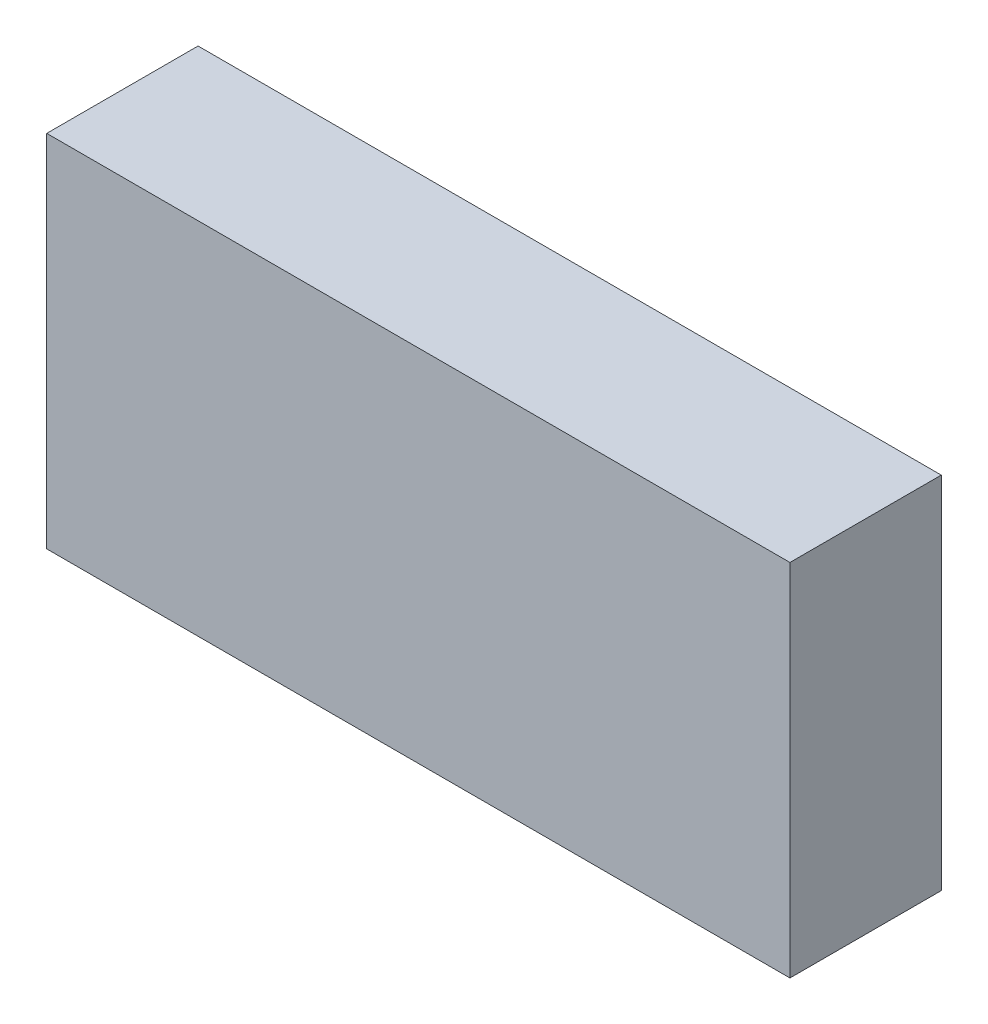
ISO-10303-21;
HEADER;
FILE_DESCRIPTION(('STEP AP214'),'2;1');
FILE_NAME('part.step','',(''),(''),'','','');
FILE_SCHEMA(('AUTOMOTIVE_DESIGN { 1 0 10303 214 1 1 1 1 }'));
ENDSEC;
DATA;
#1=APPLICATION_CONTEXT('core data for automotive mechanical design processes');
#2=APPLICATION_PROTOCOL_DEFINITION('international standard','automotive_design',2000,#1);
#3=PRODUCT_CONTEXT('',#1,'mechanical');
#4=PRODUCT('Part','Part','',(#3));
#5=PRODUCT_RELATED_PRODUCT_CATEGORY('part','',(#4));
#6=PRODUCT_DEFINITION_FORMATION('','',#4);
#7=PRODUCT_DEFINITION_CONTEXT('part definition',#1,'design');
#8=PRODUCT_DEFINITION('design','',#6,#7);
#9=PRODUCT_DEFINITION_SHAPE('','',#8);
#10=(LENGTH_UNIT() NAMED_UNIT(*) SI_UNIT(.MILLI.,.METRE.));
#11=(NAMED_UNIT(*) PLANE_ANGLE_UNIT() SI_UNIT($,.RADIAN.));
#12=(NAMED_UNIT(*) SI_UNIT($,.STERADIAN.) SOLID_ANGLE_UNIT());
#13=UNCERTAINTY_MEASURE_WITH_UNIT(LENGTH_MEASURE(1.E-05),#10,'distance_accuracy_value','');
#14=(GEOMETRIC_REPRESENTATION_CONTEXT(3) GLOBAL_UNCERTAINTY_ASSIGNED_CONTEXT((#13)) GLOBAL_UNIT_ASSIGNED_CONTEXT((#10,
#11,#12)) REPRESENTATION_CONTEXT('',''));
#15=CARTESIAN_POINT('',(0.,0.,0.));
#16=DIRECTION('',(0.,0.,1.));
#17=DIRECTION('',(1.,0.,0.));
#18=AXIS2_PLACEMENT_3D('',#15,#16,#17);
#19=CARTESIAN_POINT('',(-0.0001249999999999,-0.000125,0.6));
#20=DIRECTION('',(0.,0.,1.));
#21=DIRECTION('',(1.,0.,0.));
#22=AXIS2_PLACEMENT_3D('',#19,#20,#21);
#23=PLANE('',#22);
#24=DIRECTION('',(1.,0.,0.));
#25=VECTOR('',#24,1.);
#26=CARTESIAN_POINT('',(-1.47358,-0.71361,0.6));
#27=LINE('',#26,#25);
#28=CARTESIAN_POINT('',(-1.47358,-0.71361,0.6));
#29=VERTEX_POINT('',#28);
#30=CARTESIAN_POINT('',(1.47333,-0.71361,0.6));
#31=VERTEX_POINT('',#30);
#32=EDGE_CURVE('E81',#29,#31,#27,.T.);
#33=ORIENTED_EDGE('',*,*,#32,.T.);
#34=DIRECTION('',(0.,1.,0.));
#35=VECTOR('',#34,1.);
#36=CARTESIAN_POINT('',(1.47333,-0.71361,0.6));
#37=LINE('',#36,#35);
#38=CARTESIAN_POINT('',(1.47333,0.71336,0.6));
#39=VERTEX_POINT('',#38);
#40=EDGE_CURVE('E93',#31,#39,#37,.T.);
#41=ORIENTED_EDGE('',*,*,#40,.T.);
#42=DIRECTION('',(-1.,0.,0.));
#43=VECTOR('',#42,1.);
#44=CARTESIAN_POINT('',(1.47333,0.71336,0.6));
#45=LINE('',#44,#43);
#46=CARTESIAN_POINT('',(-1.47358,0.71336,0.6));
#47=VERTEX_POINT('',#46);
#48=EDGE_CURVE('E66',#39,#47,#45,.T.);
#49=ORIENTED_EDGE('',*,*,#48,.T.);
#50=DIRECTION('',(0.,-1.,0.));
#51=VECTOR('',#50,1.);
#52=CARTESIAN_POINT('',(-1.47358,0.71336,0.6));
#53=LINE('',#52,#51);
#54=EDGE_CURVE('E11',#47,#29,#53,.T.);
#55=ORIENTED_EDGE('',*,*,#54,.T.);
#56=EDGE_LOOP('',(#33,#41,#49,#55));
#57=FACE_BOUND('',#56,.T.);
#58=ADVANCED_FACE('F16',(#57),#23,.T.);
#59=CARTESIAN_POINT('',(-0.0001249999999999,-0.000125,0.));
#60=DIRECTION('',(0.,0.,1.));
#61=DIRECTION('',(1.,0.,0.));
#62=AXIS2_PLACEMENT_3D('',#59,#60,#61);
#63=PLANE('',#62);
#64=DIRECTION('',(1.,0.,0.));
#65=VECTOR('',#64,1.);
#66=CARTESIAN_POINT('',(-1.47358,-0.71361,0.));
#67=LINE('',#66,#65);
#68=CARTESIAN_POINT('',(-1.47358,-0.71361,0.));
#69=VERTEX_POINT('',#68);
#70=CARTESIAN_POINT('',(1.47333,-0.71361,0.));
#71=VERTEX_POINT('',#70);
#72=EDGE_CURVE('E70',#69,#71,#67,.T.);
#73=ORIENTED_EDGE('',*,*,#72,.F.);
#74=DIRECTION('',(0.,-1.,0.));
#75=VECTOR('',#74,1.);
#76=CARTESIAN_POINT('',(-1.47358,0.71336,0.));
#77=LINE('',#76,#75);
#78=CARTESIAN_POINT('',(-1.47358,0.71336,0.));
#79=VERTEX_POINT('',#78);
#80=EDGE_CURVE('E27',#79,#69,#77,.T.);
#81=ORIENTED_EDGE('',*,*,#80,.F.);
#82=DIRECTION('',(-1.,0.,0.));
#83=VECTOR('',#82,1.);
#84=CARTESIAN_POINT('',(1.47333,0.71336,0.));
#85=LINE('',#84,#83);
#86=CARTESIAN_POINT('',(1.47333,0.71336,0.));
#87=VERTEX_POINT('',#86);
#88=EDGE_CURVE('E90',#87,#79,#85,.T.);
#89=ORIENTED_EDGE('',*,*,#88,.F.);
#90=DIRECTION('',(0.,1.,0.));
#91=VECTOR('',#90,1.);
#92=CARTESIAN_POINT('',(1.47333,-0.71361,0.));
#93=LINE('',#92,#91);
#94=EDGE_CURVE('E73',#71,#87,#93,.T.);
#95=ORIENTED_EDGE('',*,*,#94,.F.);
#96=EDGE_LOOP('',(#73,#81,#89,#95));
#97=FACE_BOUND('',#96,.T.);
#98=ADVANCED_FACE('F71',(#97),#63,.F.);
#99=CARTESIAN_POINT('',(-1.47358,0.71336,0.));
#100=DIRECTION('',(1.,0.,0.));
#101=DIRECTION('',(0.,1.,0.));
#102=AXIS2_PLACEMENT_3D('',#99,#100,#101);
#103=PLANE('',#102);
#104=DIRECTION('',(0.,0.,1.));
#105=VECTOR('',#104,1.);
#106=CARTESIAN_POINT('',(-1.47358,0.71336,0.));
#107=LINE('',#106,#105);
#108=EDGE_CURVE('E61',#79,#47,#107,.T.);
#109=ORIENTED_EDGE('',*,*,#108,.F.);
#110=ORIENTED_EDGE('',*,*,#80,.T.);
#111=DIRECTION('',(0.,0.,1.));
#112=VECTOR('',#111,1.);
#113=CARTESIAN_POINT('',(-1.47358,-0.71361,0.));
#114=LINE('',#113,#112);
#115=EDGE_CURVE('E59',#69,#29,#114,.T.);
#116=ORIENTED_EDGE('',*,*,#115,.T.);
#117=ORIENTED_EDGE('',*,*,#54,.F.);
#118=EDGE_LOOP('',(#109,#110,#116,#117));
#119=FACE_BOUND('',#118,.T.);
#120=ADVANCED_FACE('F57',(#119),#103,.F.);
#121=CARTESIAN_POINT('',(1.47333,0.71336,0.));
#122=DIRECTION('',(0.,-1.,0.));
#123=DIRECTION('',(0.,0.,-1.));
#124=AXIS2_PLACEMENT_3D('',#121,#122,#123);
#125=PLANE('',#124);
#126=DIRECTION('',(0.,0.,1.));
#127=VECTOR('',#126,1.);
#128=CARTESIAN_POINT('',(1.47333,0.71336,0.));
#129=LINE('',#128,#127);
#130=EDGE_CURVE('E20',#87,#39,#129,.T.);
#131=ORIENTED_EDGE('',*,*,#130,.F.);
#132=ORIENTED_EDGE('',*,*,#88,.T.);
#133=ORIENTED_EDGE('',*,*,#108,.T.);
#134=ORIENTED_EDGE('',*,*,#48,.F.);
#135=EDGE_LOOP('',(#131,#132,#133,#134));
#136=FACE_BOUND('',#135,.T.);
#137=ADVANCED_FACE('F115',(#136),#125,.F.);
#138=CARTESIAN_POINT('',(1.47333,-0.71361,0.));
#139=DIRECTION('',(-1.,0.,0.));
#140=DIRECTION('',(0.,0.,1.));
#141=AXIS2_PLACEMENT_3D('',#138,#139,#140);
#142=PLANE('',#141);
#143=DIRECTION('',(0.,0.,1.));
#144=VECTOR('',#143,1.);
#145=CARTESIAN_POINT('',(1.47333,-0.71361,0.));
#146=LINE('',#145,#144);
#147=EDGE_CURVE('E78',#71,#31,#146,.T.);
#148=ORIENTED_EDGE('',*,*,#147,.F.);
#149=ORIENTED_EDGE('',*,*,#94,.T.);
#150=ORIENTED_EDGE('',*,*,#130,.T.);
#151=ORIENTED_EDGE('',*,*,#40,.F.);
#152=EDGE_LOOP('',(#148,#149,#150,#151));
#153=FACE_BOUND('',#152,.T.);
#154=ADVANCED_FACE('F111',(#153),#142,.F.);
#155=CARTESIAN_POINT('',(-1.47358,-0.71361,0.));
#156=DIRECTION('',(0.,1.,0.));
#157=DIRECTION('',(1.,0.,0.));
#158=AXIS2_PLACEMENT_3D('',#155,#156,#157);
#159=PLANE('',#158);
#160=ORIENTED_EDGE('',*,*,#115,.F.);
#161=ORIENTED_EDGE('',*,*,#72,.T.);
#162=ORIENTED_EDGE('',*,*,#147,.T.);
#163=ORIENTED_EDGE('',*,*,#32,.F.);
#164=EDGE_LOOP('',(#160,#161,#162,#163));
#165=FACE_BOUND('',#164,.T.);
#166=ADVANCED_FACE('F18',(#165),#159,.F.);
#167=CLOSED_SHELL('',(#58,#98,#120,#137,#154,#166));
#168=MANIFOLD_SOLID_BREP('B1',#167);
#169=ADVANCED_BREP_SHAPE_REPRESENTATION('',(#18,#168),#14);
#170=SHAPE_DEFINITION_REPRESENTATION(#9,#169);
ENDSEC;
END-ISO-10303-21;
